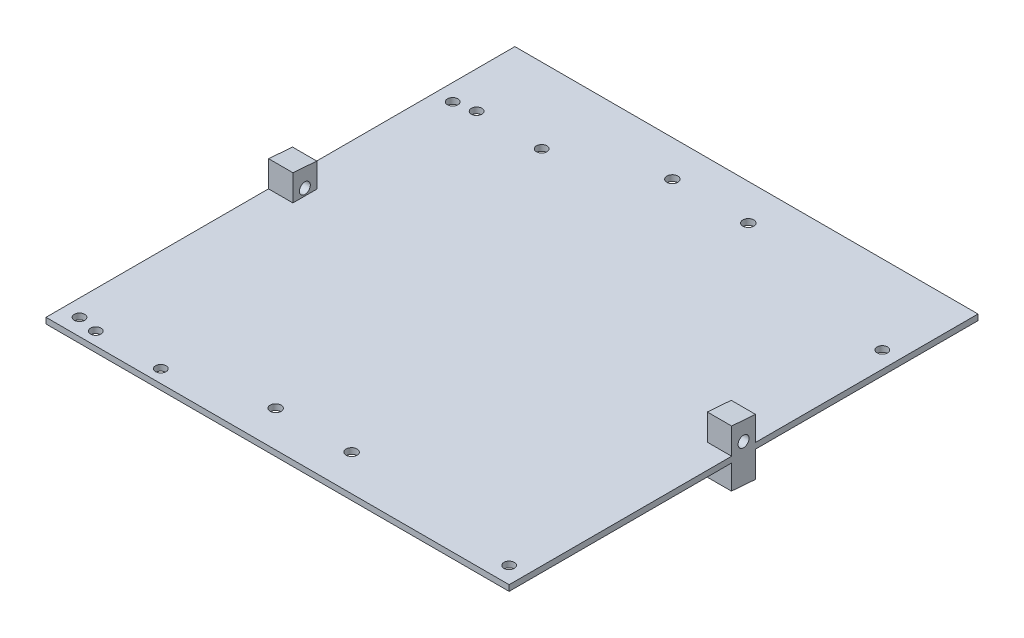
ISO-10303-21;
HEADER;
FILE_DESCRIPTION(('STEP AP214'),'2;1');
FILE_NAME('part.step','',(''),(''),'','','');
FILE_SCHEMA(('AUTOMOTIVE_DESIGN { 1 0 10303 214 1 1 1 1 }'));
ENDSEC;
DATA;
#1=APPLICATION_CONTEXT('core data for automotive mechanical design processes');
#2=APPLICATION_PROTOCOL_DEFINITION('international standard','automotive_design',2000,#1);
#3=PRODUCT_CONTEXT('',#1,'mechanical');
#4=PRODUCT('Part','Part','',(#3));
#5=PRODUCT_RELATED_PRODUCT_CATEGORY('part','',(#4));
#6=PRODUCT_DEFINITION_FORMATION('','',#4);
#7=PRODUCT_DEFINITION_CONTEXT('part definition',#1,'design');
#8=PRODUCT_DEFINITION('design','',#6,#7);
#9=PRODUCT_DEFINITION_SHAPE('','',#8);
#10=(LENGTH_UNIT() NAMED_UNIT(*) SI_UNIT(.MILLI.,.METRE.));
#11=(NAMED_UNIT(*) PLANE_ANGLE_UNIT() SI_UNIT($,.RADIAN.));
#12=(NAMED_UNIT(*) SI_UNIT($,.STERADIAN.) SOLID_ANGLE_UNIT());
#13=UNCERTAINTY_MEASURE_WITH_UNIT(LENGTH_MEASURE(1.E-05),#10,'distance_accuracy_value','');
#14=(GEOMETRIC_REPRESENTATION_CONTEXT(3) GLOBAL_UNCERTAINTY_ASSIGNED_CONTEXT((#13)) GLOBAL_UNIT_ASSIGNED_CONTEXT((#10,
#11,#12)) REPRESENTATION_CONTEXT('',''));
#15=CARTESIAN_POINT('',(0.,0.,0.));
#16=DIRECTION('',(0.,0.,1.));
#17=DIRECTION('',(1.,0.,0.));
#18=AXIS2_PLACEMENT_3D('',#15,#16,#17);
#19=CARTESIAN_POINT('',(0.,0.,0.));
#20=DIRECTION('',(0.,1.,0.));
#21=DIRECTION('',(0.,0.,1.));
#22=AXIS2_PLACEMENT_3D('',#19,#20,#21);
#23=PLANE('',#22);
#24=CARTESIAN_POINT('',(56.337499948,0.,90.459375));
#25=DIRECTION('',(0.,1.,0.));
#26=DIRECTION('',(0.,0.,1.));
#27=AXIS2_PLACEMENT_3D('',#24,#25,#26);
#28=CIRCLE('',#27,1.14299999999999);
#29=CARTESIAN_POINT('',(56.337499948,0.,91.602375));
#30=VERTEX_POINT('',#29);
#31=EDGE_CURVE('E330',#30,#30,#28,.F.);
#32=ORIENTED_EDGE('',*,*,#31,.F.);
#33=EDGE_LOOP('',(#32));
#34=FACE_BOUND('',#33,.T.);
#35=CARTESIAN_POINT('',(40.462499948,0.,90.459375));
#36=DIRECTION('',(0.,1.,0.));
#37=DIRECTION('',(0.,0.,1.));
#38=AXIS2_PLACEMENT_3D('',#35,#36,#37);
#39=CIRCLE('',#38,1.143);
#40=CARTESIAN_POINT('',(40.462499948,0.,91.602375));
#41=VERTEX_POINT('',#40);
#42=EDGE_CURVE('E323',#41,#41,#39,.F.);
#43=ORIENTED_EDGE('',*,*,#42,.F.);
#44=EDGE_LOOP('',(#43));
#45=FACE_BOUND('',#44,.T.);
#46=CARTESIAN_POINT('',(40.462499948,0.,7.540625));
#47=DIRECTION('',(0.,1.,0.));
#48=DIRECTION('',(0.,0.,1.));
#49=AXIS2_PLACEMENT_3D('',#46,#47,#48);
#50=CIRCLE('',#49,1.143);
#51=CARTESIAN_POINT('',(40.462499948,0.,8.683625));
#52=VERTEX_POINT('',#51);
#53=EDGE_CURVE('E322',#52,#52,#50,.F.);
#54=ORIENTED_EDGE('',*,*,#53,.F.);
#55=EDGE_LOOP('',(#54));
#56=FACE_BOUND('',#55,.T.);
#57=CARTESIAN_POINT('',(56.337499948,0.,7.540625));
#58=DIRECTION('',(0.,1.,0.));
#59=DIRECTION('',(0.,0.,1.));
#60=AXIS2_PLACEMENT_3D('',#57,#58,#59);
#61=CIRCLE('',#60,1.143);
#62=CARTESIAN_POINT('',(56.337499948,0.,8.68362499999999));
#63=VERTEX_POINT('',#62);
#64=EDGE_CURVE('E339',#63,#63,#61,.F.);
#65=ORIENTED_EDGE('',*,*,#64,.F.);
#66=EDGE_LOOP('',(#65));
#67=FACE_BOUND('',#66,.T.);
#68=CARTESIAN_POINT('',(7.70000000000002,0.,95.3));
#69=DIRECTION('',(0.,-1.,0.));
#70=DIRECTION('',(0.,0.,-1.));
#71=AXIS2_PLACEMENT_3D('',#68,#69,#70);
#72=CIRCLE('',#71,1.09220000000001);
#73=CARTESIAN_POINT('',(7.70000000000002,0.,94.2078));
#74=VERTEX_POINT('',#73);
#75=EDGE_CURVE('E361',#74,#74,#72,.T.);
#76=ORIENTED_EDGE('',*,*,#75,.F.);
#77=EDGE_LOOP('',(#76));
#78=FACE_BOUND('',#77,.T.);
#79=CARTESIAN_POINT('',(21.3,0.,95.3));
#80=DIRECTION('',(0.,-1.,0.));
#81=DIRECTION('',(0.,0.,-1.));
#82=AXIS2_PLACEMENT_3D('',#79,#80,#81);
#83=CIRCLE('',#82,1.09220000000001);
#84=CARTESIAN_POINT('',(21.3,0.,94.2078));
#85=VERTEX_POINT('',#84);
#86=EDGE_CURVE('E368',#85,#85,#83,.T.);
#87=ORIENTED_EDGE('',*,*,#86,.F.);
#88=EDGE_LOOP('',(#87));
#89=FACE_BOUND('',#88,.T.);
#90=CARTESIAN_POINT('',(93.3,0.,94.4999999999999));
#91=DIRECTION('',(0.,-1.,0.));
#92=DIRECTION('',(0.,0.,-1.));
#93=AXIS2_PLACEMENT_3D('',#90,#91,#92);
#94=CIRCLE('',#93,1.0922);
#95=CARTESIAN_POINT('',(93.3,0.,93.4077999999999));
#96=VERTEX_POINT('',#95);
#97=EDGE_CURVE('E374',#96,#96,#94,.T.);
#98=ORIENTED_EDGE('',*,*,#97,.F.);
#99=EDGE_LOOP('',(#98));
#100=FACE_BOUND('',#99,.T.);
#101=CARTESIAN_POINT('',(93.3,0.,16.5));
#102=DIRECTION('',(0.,-1.,0.));
#103=DIRECTION('',(0.,0.,-1.));
#104=AXIS2_PLACEMENT_3D('',#101,#102,#103);
#105=CIRCLE('',#104,1.0922);
#106=CARTESIAN_POINT('',(93.3,0.,15.4078));
#107=VERTEX_POINT('',#106);
#108=EDGE_CURVE('E380',#107,#107,#105,.T.);
#109=ORIENTED_EDGE('',*,*,#108,.F.);
#110=EDGE_LOOP('',(#109));
#111=FACE_BOUND('',#110,.T.);
#112=CARTESIAN_POINT('',(3.5,0.,16.5));
#113=DIRECTION('',(0.,-1.,0.));
#114=DIRECTION('',(0.,0.,-1.));
#115=AXIS2_PLACEMENT_3D('',#112,#113,#114);
#116=CIRCLE('',#115,1.0922);
#117=CARTESIAN_POINT('',(3.5,0.,15.4078));
#118=VERTEX_POINT('',#117);
#119=EDGE_CURVE('E343',#118,#118,#116,.T.);
#120=ORIENTED_EDGE('',*,*,#119,.F.);
#121=EDGE_LOOP('',(#120));
#122=FACE_BOUND('',#121,.T.);
#123=CARTESIAN_POINT('',(7.7,0.,15.7));
#124=DIRECTION('',(0.,-1.,0.));
#125=DIRECTION('',(0.,0.,-1.));
#126=AXIS2_PLACEMENT_3D('',#123,#124,#125);
#127=CIRCLE('',#126,1.09220000000001);
#128=CARTESIAN_POINT('',(7.7,0.,14.6078));
#129=VERTEX_POINT('',#128);
#130=EDGE_CURVE('E350',#129,#129,#127,.T.);
#131=ORIENTED_EDGE('',*,*,#130,.F.);
#132=EDGE_LOOP('',(#131));
#133=FACE_BOUND('',#132,.T.);
#134=CARTESIAN_POINT('',(21.3,0.,15.7));
#135=DIRECTION('',(0.,-1.,0.));
#136=DIRECTION('',(0.,0.,-1.));
#137=AXIS2_PLACEMENT_3D('',#134,#135,#136);
#138=CIRCLE('',#137,1.09220000000001);
#139=CARTESIAN_POINT('',(21.3,0.,14.6078));
#140=VERTEX_POINT('',#139);
#141=EDGE_CURVE('E356',#140,#140,#138,.T.);
#142=ORIENTED_EDGE('',*,*,#141,.F.);
#143=EDGE_LOOP('',(#142));
#144=FACE_BOUND('',#143,.T.);
#145=CARTESIAN_POINT('',(3.50000000000002,0.,94.5));
#146=DIRECTION('',(0.,-1.,0.));
#147=DIRECTION('',(0.,0.,-1.));
#148=AXIS2_PLACEMENT_3D('',#145,#146,#147);
#149=CIRCLE('',#148,1.09220000000001);
#150=CARTESIAN_POINT('',(3.50000000000002,0.,93.4078));
#151=VERTEX_POINT('',#150);
#152=EDGE_CURVE('E385',#151,#151,#149,.T.);
#153=ORIENTED_EDGE('',*,*,#152,.F.);
#154=EDGE_LOOP('',(#153));
#155=FACE_BOUND('',#154,.T.);
#156=DIRECTION('',(-1.,0.,0.));
#157=VECTOR('',#156,1.);
#158=CARTESIAN_POINT('',(96.799999948,0.,51.54));
#159=LINE('',#158,#157);
#160=CARTESIAN_POINT('',(96.799999948,0.,51.54));
#161=VERTEX_POINT('',#160);
#162=CARTESIAN_POINT('',(91.719999948,0.,51.54));
#163=VERTEX_POINT('',#162);
#164=EDGE_CURVE('E240',#161,#163,#159,.T.);
#165=ORIENTED_EDGE('',*,*,#164,.F.);
#166=DIRECTION('',(0.,0.,-1.));
#167=VECTOR('',#166,1.);
#168=CARTESIAN_POINT('',(96.799999948,0.,0.));
#169=LINE('',#168,#167);
#170=CARTESIAN_POINT('',(96.799999948,0.,98.));
#171=VERTEX_POINT('',#170);
#172=EDGE_CURVE('E410',#171,#161,#169,.T.);
#173=ORIENTED_EDGE('',*,*,#172,.F.);
#174=DIRECTION('',(1.,0.,0.));
#175=VECTOR('',#174,1.);
#176=CARTESIAN_POINT('',(0.,0.,98.));
#177=LINE('',#176,#175);
#178=CARTESIAN_POINT('',(0.,0.,98.));
#179=VERTEX_POINT('',#178);
#180=EDGE_CURVE('E407',#179,#171,#177,.T.);
#181=ORIENTED_EDGE('',*,*,#180,.F.);
#182=DIRECTION('',(0.,0.,1.));
#183=VECTOR('',#182,1.);
#184=CARTESIAN_POINT('',(0.,0.,0.));
#185=LINE('',#184,#183);
#186=CARTESIAN_POINT('',(0.,0.,51.54));
#187=VERTEX_POINT('',#186);
#188=EDGE_CURVE('E388',#187,#179,#185,.T.);
#189=ORIENTED_EDGE('',*,*,#188,.F.);
#190=DIRECTION('',(-1.,0.,0.));
#191=VECTOR('',#190,1.);
#192=CARTESIAN_POINT('',(0.,0.,51.54));
#193=LINE('',#192,#191);
#194=CARTESIAN_POINT('',(5.08,0.,51.54));
#195=VERTEX_POINT('',#194);
#196=EDGE_CURVE('E263',#195,#187,#193,.T.);
#197=ORIENTED_EDGE('',*,*,#196,.F.);
#198=DIRECTION('',(0.,0.,1.));
#199=VECTOR('',#198,1.);
#200=CARTESIAN_POINT('',(5.08,0.,51.54));
#201=LINE('',#200,#199);
#202=CARTESIAN_POINT('',(5.08,0.,46.46));
#203=VERTEX_POINT('',#202);
#204=EDGE_CURVE('E72',#203,#195,#201,.T.);
#205=ORIENTED_EDGE('',*,*,#204,.F.);
#206=DIRECTION('',(1.,0.,0.));
#207=VECTOR('',#206,1.);
#208=CARTESIAN_POINT('',(5.08,0.,46.46));
#209=LINE('',#208,#207);
#210=CARTESIAN_POINT('',(0.,0.,46.46));
#211=VERTEX_POINT('',#210);
#212=EDGE_CURVE('E258',#211,#203,#209,.T.);
#213=ORIENTED_EDGE('',*,*,#212,.F.);
#214=CARTESIAN_POINT('',(0.,0.,0.));
#215=VERTEX_POINT('',#214);
#216=EDGE_CURVE('E404',#215,#211,#185,.T.);
#217=ORIENTED_EDGE('',*,*,#216,.F.);
#218=DIRECTION('',(-1.,0.,0.));
#219=VECTOR('',#218,1.);
#220=CARTESIAN_POINT('',(0.,0.,0.));
#221=LINE('',#220,#219);
#222=CARTESIAN_POINT('',(96.799999948,0.,0.));
#223=VERTEX_POINT('',#222);
#224=EDGE_CURVE('E395',#223,#215,#221,.T.);
#225=ORIENTED_EDGE('',*,*,#224,.F.);
#226=CARTESIAN_POINT('',(96.799999948,0.,46.46));
#227=VERTEX_POINT('',#226);
#228=EDGE_CURVE('E409',#227,#223,#169,.T.);
#229=ORIENTED_EDGE('',*,*,#228,.F.);
#230=DIRECTION('',(1.,0.,0.));
#231=VECTOR('',#230,1.);
#232=CARTESIAN_POINT('',(91.719999948,0.,46.46));
#233=LINE('',#232,#231);
#234=CARTESIAN_POINT('',(91.719999948,0.,46.46));
#235=VERTEX_POINT('',#234);
#236=EDGE_CURVE('E244',#235,#227,#233,.T.);
#237=ORIENTED_EDGE('',*,*,#236,.F.);
#238=DIRECTION('',(0.,0.,-1.));
#239=VECTOR('',#238,1.);
#240=CARTESIAN_POINT('',(91.719999948,0.,51.54));
#241=LINE('',#240,#239);
#242=EDGE_CURVE('E246',#163,#235,#241,.T.);
#243=ORIENTED_EDGE('',*,*,#242,.F.);
#244=EDGE_LOOP('',(#165,#173,#181,#189,#197,#205,#213,#217,#225,#229,#237,#243));
#245=FACE_BOUND('',#244,.T.);
#246=ADVANCED_FACE('F47',(#34,#45,#56,#67,#78,#89,#100,#111,#122,#133,#144,#155,#245),#23,.F.);
#247=CARTESIAN_POINT('',(0.0259999480000245,1.2192,46.5));
#248=DIRECTION('',(0.,0.,-1.));
#249=DIRECTION('',(-1.,0.,0.));
#250=AXIS2_PLACEMENT_3D('',#247,#248,#249);
#251=PLANE('',#250);
#252=DIRECTION('',(0.,1.,0.));
#253=VECTOR('',#252,1.);
#254=CARTESIAN_POINT('',(91.719999948,1.2192,46.5));
#255=LINE('',#254,#253);
#256=CARTESIAN_POINT('',(91.719999948,1.2192,46.5));
#257=VERTEX_POINT('',#256);
#258=CARTESIAN_POINT('',(91.719999948,6.2992,46.5));
#259=VERTEX_POINT('',#258);
#260=EDGE_CURVE('E284',#257,#259,#255,.T.);
#261=ORIENTED_EDGE('',*,*,#260,.T.);
#262=DIRECTION('',(1.,0.,0.));
#263=VECTOR('',#262,1.);
#264=CARTESIAN_POINT('',(0.0259999480000245,6.2992,46.5));
#265=LINE('',#264,#263);
#266=CARTESIAN_POINT('',(96.799999948,6.2992,46.5));
#267=VERTEX_POINT('',#266);
#268=EDGE_CURVE('E305',#259,#267,#265,.T.);
#269=ORIENTED_EDGE('',*,*,#268,.T.);
#270=DIRECTION('',(0.,1.,0.));
#271=VECTOR('',#270,1.);
#272=CARTESIAN_POINT('',(96.799999948,1.2192,46.5));
#273=LINE('',#272,#271);
#274=CARTESIAN_POINT('',(96.799999948,1.2192,46.5));
#275=VERTEX_POINT('',#274);
#276=EDGE_CURVE('E293',#275,#267,#273,.T.);
#277=ORIENTED_EDGE('',*,*,#276,.F.);
#278=DIRECTION('',(1.,0.,0.));
#279=VECTOR('',#278,1.);
#280=CARTESIAN_POINT('',(0.0259999480000245,1.2192,46.5));
#281=LINE('',#280,#279);
#282=EDGE_CURVE('E314',#257,#275,#281,.T.);
#283=ORIENTED_EDGE('',*,*,#282,.F.);
#284=EDGE_LOOP('',(#261,#269,#277,#283));
#285=FACE_BOUND('',#284,.T.);
#286=ADVANCED_FACE('F444',(#285),#251,.T.);
#287=CARTESIAN_POINT('',(0.0259999480000245,1.2192,51.5));
#288=DIRECTION('',(0.,0.,1.));
#289=DIRECTION('',(1.,0.,0.));
#290=AXIS2_PLACEMENT_3D('',#287,#288,#289);
#291=PLANE('',#290);
#292=DIRECTION('',(0.,1.,0.));
#293=VECTOR('',#292,1.);
#294=CARTESIAN_POINT('',(91.719999948,1.2192,51.5));
#295=LINE('',#294,#293);
#296=CARTESIAN_POINT('',(91.719999948,1.2192,51.5));
#297=VERTEX_POINT('',#296);
#298=CARTESIAN_POINT('',(91.719999948,6.69270853412306,51.5));
#299=VERTEX_POINT('',#298);
#300=EDGE_CURVE('E196',#297,#299,#295,.T.);
#301=ORIENTED_EDGE('',*,*,#300,.F.);
#302=DIRECTION('',(1.,0.,0.));
#303=VECTOR('',#302,1.);
#304=CARTESIAN_POINT('',(0.0259999480000245,1.2192,51.5));
#305=LINE('',#304,#303);
#306=CARTESIAN_POINT('',(96.799999948,1.2192,51.5));
#307=VERTEX_POINT('',#306);
#308=EDGE_CURVE('E316',#297,#307,#305,.T.);
#309=ORIENTED_EDGE('',*,*,#308,.T.);
#310=DIRECTION('',(0.,-1.,0.));
#311=VECTOR('',#310,1.);
#312=CARTESIAN_POINT('',(96.799999948,1.2192,51.5));
#313=LINE('',#312,#311);
#314=CARTESIAN_POINT('',(96.799999948,6.69270853412306,51.5));
#315=VERTEX_POINT('',#314);
#316=EDGE_CURVE('E300',#315,#307,#313,.T.);
#317=ORIENTED_EDGE('',*,*,#316,.F.);
#318=DIRECTION('',(1.,0.,0.));
#319=VECTOR('',#318,1.);
#320=CARTESIAN_POINT('',(91.719999948,6.69270853412306,51.5));
#321=LINE('',#320,#319);
#322=EDGE_CURVE('E218',#299,#315,#321,.T.);
#323=ORIENTED_EDGE('',*,*,#322,.F.);
#324=EDGE_LOOP('',(#301,#309,#317,#323));
#325=FACE_BOUND('',#324,.T.);
#326=ADVANCED_FACE('F451',(#325),#291,.T.);
#327=CARTESIAN_POINT('',(0.0259999480000245,2.64795,49.));
#328=DIRECTION('',(1.,0.,0.));
#329=DIRECTION('',(0.,0.,-1.));
#330=AXIS2_PLACEMENT_3D('',#327,#328,#329);
#331=CYLINDRICAL_SURFACE('',#330,1.143);
#332=CARTESIAN_POINT('',(91.719999948,2.64795,49.));
#333=DIRECTION('',(1.,0.,0.));
#334=DIRECTION('',(0.,0.,-1.));
#335=AXIS2_PLACEMENT_3D('',#332,#333,#334);
#336=CIRCLE('',#335,1.143);
#337=CARTESIAN_POINT('',(91.719999948,2.64795,47.857));
#338=VERTEX_POINT('',#337);
#339=EDGE_CURVE('E51',#338,#338,#336,.F.);
#340=ORIENTED_EDGE('',*,*,#339,.T.);
#341=EDGE_LOOP('',(#340));
#342=FACE_BOUND('',#341,.T.);
#343=CARTESIAN_POINT('',(96.799999948,2.64795,49.));
#344=DIRECTION('',(1.,0.,0.));
#345=DIRECTION('',(0.,0.,-1.));
#346=AXIS2_PLACEMENT_3D('',#343,#344,#345);
#347=CIRCLE('',#346,1.143);
#348=CARTESIAN_POINT('',(96.799999948,2.64795,47.857));
#349=VERTEX_POINT('',#348);
#350=EDGE_CURVE('E294',#349,#349,#347,.T.);
#351=ORIENTED_EDGE('',*,*,#350,.T.);
#352=EDGE_LOOP('',(#351));
#353=FACE_BOUND('',#352,.T.);
#354=ADVANCED_FACE('F426',(#342,#353),#331,.F.);
#355=CARTESIAN_POINT('',(0.,1.2192,0.));
#356=DIRECTION('',(1.,0.,0.));
#357=DIRECTION('',(0.,0.,-1.));
#358=AXIS2_PLACEMENT_3D('',#355,#356,#357);
#359=PLANE('',#358);
#360=ORIENTED_EDGE('',*,*,#216,.T.);
#361=DIRECTION('',(0.,1.,0.));
#362=VECTOR('',#361,1.);
#363=CARTESIAN_POINT('',(0.,-5.08,46.46));
#364=LINE('',#363,#362);
#365=CARTESIAN_POINT('',(0.,-5.47980467066903,46.46));
#366=VERTEX_POINT('',#365);
#367=EDGE_CURVE('E276',#366,#211,#364,.T.);
#368=ORIENTED_EDGE('',*,*,#367,.F.);
#369=DIRECTION('',(0.,0.0784590957278381,0.996917333733129));
#370=VECTOR('',#369,1.);
#371=CARTESIAN_POINT('',(0.,-5.47980467066903,46.46));
#372=LINE('',#371,#370);
#373=CARTESIAN_POINT('',(0.,-5.08,51.54));
#374=VERTEX_POINT('',#373);
#375=EDGE_CURVE('E231',#366,#374,#372,.T.);
#376=ORIENTED_EDGE('',*,*,#375,.T.);
#377=DIRECTION('',(0.,1.,0.));
#378=VECTOR('',#377,1.);
#379=CARTESIAN_POINT('',(0.,-5.08,51.54));
#380=LINE('',#379,#378);
#381=EDGE_CURVE('E262',#374,#187,#380,.T.);
#382=ORIENTED_EDGE('',*,*,#381,.T.);
#383=ORIENTED_EDGE('',*,*,#188,.T.);
#384=DIRECTION('',(0.,-1.,0.));
#385=VECTOR('',#384,1.);
#386=CARTESIAN_POINT('',(0.,1.2192,98.));
#387=LINE('',#386,#385);
#388=CARTESIAN_POINT('',(0.,1.2192,98.));
#389=VERTEX_POINT('',#388);
#390=EDGE_CURVE('E13',#389,#179,#387,.T.);
#391=ORIENTED_EDGE('',*,*,#390,.F.);
#392=DIRECTION('',(0.,0.,1.));
#393=VECTOR('',#392,1.);
#394=CARTESIAN_POINT('',(0.,1.2192,0.));
#395=LINE('',#394,#393);
#396=CARTESIAN_POINT('',(0.,1.2192,0.));
#397=VERTEX_POINT('',#396);
#398=EDGE_CURVE('E391',#397,#389,#395,.T.);
#399=ORIENTED_EDGE('',*,*,#398,.F.);
#400=DIRECTION('',(0.,-1.,0.));
#401=VECTOR('',#400,1.);
#402=CARTESIAN_POINT('',(0.,1.2192,0.));
#403=LINE('',#402,#401);
#404=EDGE_CURVE('E403',#397,#215,#403,.T.);
#405=ORIENTED_EDGE('',*,*,#404,.T.);
#406=EDGE_LOOP('',(#360,#368,#376,#382,#383,#391,#399,#405));
#407=FACE_BOUND('',#406,.T.);
#408=ADVANCED_FACE('F49',(#407),#359,.F.);
#409=CARTESIAN_POINT('',(0.,1.2192,98.));
#410=DIRECTION('',(0.,0.,-1.));
#411=DIRECTION('',(-1.,0.,0.));
#412=AXIS2_PLACEMENT_3D('',#409,#410,#411);
#413=PLANE('',#412);
#414=ORIENTED_EDGE('',*,*,#180,.T.);
#415=DIRECTION('',(0.,-1.,0.));
#416=VECTOR('',#415,1.);
#417=CARTESIAN_POINT('',(96.799999948,1.2192,98.));
#418=LINE('',#417,#416);
#419=CARTESIAN_POINT('',(96.799999948,1.2192,98.));
#420=VERTEX_POINT('',#419);
#421=EDGE_CURVE('E56',#420,#171,#418,.T.);
#422=ORIENTED_EDGE('',*,*,#421,.F.);
#423=DIRECTION('',(1.,0.,0.));
#424=VECTOR('',#423,1.);
#425=CARTESIAN_POINT('',(0.,1.2192,98.));
#426=LINE('',#425,#424);
#427=EDGE_CURVE('E394',#389,#420,#426,.T.);
#428=ORIENTED_EDGE('',*,*,#427,.F.);
#429=ORIENTED_EDGE('',*,*,#390,.T.);
#430=EDGE_LOOP('',(#414,#422,#428,#429));
#431=FACE_BOUND('',#430,.T.);
#432=ADVANCED_FACE('F467',(#431),#413,.F.);
#433=CARTESIAN_POINT('',(96.799999948,1.2192,0.));
#434=DIRECTION('',(-1.,0.,0.));
#435=DIRECTION('',(0.,0.,1.));
#436=AXIS2_PLACEMENT_3D('',#433,#434,#435);
#437=PLANE('',#436);
#438=ORIENTED_EDGE('',*,*,#172,.T.);
#439=DIRECTION('',(0.,1.,0.));
#440=VECTOR('',#439,1.);
#441=CARTESIAN_POINT('',(96.799999948,-5.08,51.54));
#442=LINE('',#441,#440);
#443=CARTESIAN_POINT('',(96.799999948,-5.08,51.54));
#444=VERTEX_POINT('',#443);
#445=EDGE_CURVE('E256',#444,#161,#442,.T.);
#446=ORIENTED_EDGE('',*,*,#445,.F.);
#447=DIRECTION('',(0.,-0.0784590957278448,-0.996917333733128));
#448=VECTOR('',#447,1.);
#449=CARTESIAN_POINT('',(96.799999948,-5.47980467066906,46.46));
#450=LINE('',#449,#448);
#451=CARTESIAN_POINT('',(96.799999948,-5.47980467066906,46.46));
#452=VERTEX_POINT('',#451);
#453=EDGE_CURVE('E223',#444,#452,#450,.T.);
#454=ORIENTED_EDGE('',*,*,#453,.T.);
#455=DIRECTION('',(0.,1.,0.));
#456=VECTOR('',#455,1.);
#457=CARTESIAN_POINT('',(96.799999948,-5.08,46.46));
#458=LINE('',#457,#456);
#459=EDGE_CURVE('E64',#452,#227,#458,.T.);
#460=ORIENTED_EDGE('',*,*,#459,.T.);
#461=ORIENTED_EDGE('',*,*,#228,.T.);
#462=DIRECTION('',(0.,-1.,0.));
#463=VECTOR('',#462,1.);
#464=CARTESIAN_POINT('',(96.799999948,1.2192,0.));
#465=LINE('',#464,#463);
#466=CARTESIAN_POINT('',(96.799999948,1.2192,0.));
#467=VERTEX_POINT('',#466);
#468=EDGE_CURVE('E416',#467,#223,#465,.T.);
#469=ORIENTED_EDGE('',*,*,#468,.F.);
#470=DIRECTION('',(0.,0.,-1.));
#471=VECTOR('',#470,1.);
#472=CARTESIAN_POINT('',(96.799999948,1.2192,0.));
#473=LINE('',#472,#471);
#474=EDGE_CURVE('E397',#275,#467,#473,.T.);
#475=ORIENTED_EDGE('',*,*,#474,.F.);
#476=ORIENTED_EDGE('',*,*,#276,.T.);
#477=DIRECTION('',(0.,0.0784590957278373,0.996917333733128));
#478=VECTOR('',#477,1.);
#479=CARTESIAN_POINT('',(96.799999948,6.69270853412306,51.5));
#480=LINE('',#479,#478);
#481=EDGE_CURVE('E206',#267,#315,#480,.T.);
#482=ORIENTED_EDGE('',*,*,#481,.T.);
#483=ORIENTED_EDGE('',*,*,#316,.T.);
#484=EDGE_CURVE('E398',#420,#307,#473,.T.);
#485=ORIENTED_EDGE('',*,*,#484,.F.);
#486=ORIENTED_EDGE('',*,*,#421,.T.);
#487=EDGE_LOOP('',(#438,#446,#454,#460,#461,#469,#475,#476,#482,#483,#485,#486));
#488=FACE_BOUND('',#487,.T.);
#489=ORIENTED_EDGE('',*,*,#350,.F.);
#490=EDGE_LOOP('',(#489));
#491=FACE_BOUND('',#490,.T.);
#492=ADVANCED_FACE('F464',(#488,#491),#437,.F.);
#493=CARTESIAN_POINT('',(0.,1.2192,0.));
#494=DIRECTION('',(0.,0.,1.));
#495=DIRECTION('',(1.,0.,0.));
#496=AXIS2_PLACEMENT_3D('',#493,#494,#495);
#497=PLANE('',#496);
#498=ORIENTED_EDGE('',*,*,#224,.T.);
#499=ORIENTED_EDGE('',*,*,#404,.F.);
#500=DIRECTION('',(-1.,0.,0.));
#501=VECTOR('',#500,1.);
#502=CARTESIAN_POINT('',(0.,1.2192,0.));
#503=LINE('',#502,#501);
#504=EDGE_CURVE('E401',#467,#397,#503,.T.);
#505=ORIENTED_EDGE('',*,*,#504,.F.);
#506=ORIENTED_EDGE('',*,*,#468,.T.);
#507=EDGE_LOOP('',(#498,#499,#505,#506));
#508=FACE_BOUND('',#507,.T.);
#509=ADVANCED_FACE('F461',(#508),#497,.F.);
#510=CARTESIAN_POINT('',(0.,1.2192,0.));
#511=DIRECTION('',(0.,1.,0.));
#512=DIRECTION('',(0.,0.,1.));
#513=AXIS2_PLACEMENT_3D('',#510,#511,#512);
#514=PLANE('',#513);
#515=CARTESIAN_POINT('',(0.0259999480000245,1.2192,46.5));
#516=VERTEX_POINT('',#515);
#517=CARTESIAN_POINT('',(5.10599994800002,1.2192,46.5));
#518=VERTEX_POINT('',#517);
#519=EDGE_CURVE('E310',#516,#518,#281,.T.);
#520=ORIENTED_EDGE('',*,*,#519,.T.);
#521=DIRECTION('',(0.,0.,1.));
#522=VECTOR('',#521,1.);
#523=CARTESIAN_POINT('',(5.10599994800002,1.2192,51.5));
#524=LINE('',#523,#522);
#525=CARTESIAN_POINT('',(5.10599994800002,1.2192,51.5));
#526=VERTEX_POINT('',#525);
#527=EDGE_CURVE('E282',#518,#526,#524,.T.);
#528=ORIENTED_EDGE('',*,*,#527,.T.);
#529=CARTESIAN_POINT('',(0.0259999480000245,1.2192,51.5));
#530=VERTEX_POINT('',#529);
#531=EDGE_CURVE('E192',#530,#526,#305,.T.);
#532=ORIENTED_EDGE('',*,*,#531,.F.);
#533=DIRECTION('',(0.,0.,-1.));
#534=VECTOR('',#533,1.);
#535=CARTESIAN_POINT('',(0.0259999480000245,1.2192,46.5));
#536=LINE('',#535,#534);
#537=EDGE_CURVE('E302',#530,#516,#536,.T.);
#538=ORIENTED_EDGE('',*,*,#537,.T.);
#539=EDGE_LOOP('',(#520,#528,#532,#538));
#540=FACE_BOUND('',#539,.T.);
#541=DIRECTION('',(0.,0.,-1.));
#542=VECTOR('',#541,1.);
#543=CARTESIAN_POINT('',(91.719999948,1.2192,51.5));
#544=LINE('',#543,#542);
#545=EDGE_CURVE('E279',#297,#257,#544,.T.);
#546=ORIENTED_EDGE('',*,*,#545,.T.);
#547=ORIENTED_EDGE('',*,*,#282,.T.);
#548=ORIENTED_EDGE('',*,*,#474,.T.);
#549=ORIENTED_EDGE('',*,*,#504,.T.);
#550=ORIENTED_EDGE('',*,*,#398,.T.);
#551=ORIENTED_EDGE('',*,*,#427,.T.);
#552=ORIENTED_EDGE('',*,*,#484,.T.);
#553=ORIENTED_EDGE('',*,*,#308,.F.);
#554=EDGE_LOOP('',(#546,#547,#548,#549,#550,#551,#552,#553));
#555=FACE_BOUND('',#554,.T.);
#556=CARTESIAN_POINT('',(56.337499948,1.2192,90.459375));
#557=DIRECTION('',(0.,1.,0.));
#558=DIRECTION('',(0.,0.,-1.));
#559=AXIS2_PLACEMENT_3D('',#556,#557,#558);
#560=CIRCLE('',#559,1.14299999999999);
#561=CARTESIAN_POINT('',(56.337499948,1.2192,89.316375));
#562=VERTEX_POINT('',#561);
#563=EDGE_CURVE('E313',#562,#562,#560,.T.);
#564=ORIENTED_EDGE('',*,*,#563,.F.);
#565=EDGE_LOOP('',(#564));
#566=FACE_BOUND('',#565,.T.);
#567=CARTESIAN_POINT('',(40.462499948,1.2192,90.459375));
#568=DIRECTION('',(0.,1.,0.));
#569=DIRECTION('',(0.,0.,-1.));
#570=AXIS2_PLACEMENT_3D('',#567,#568,#569);
#571=CIRCLE('',#570,1.143);
#572=CARTESIAN_POINT('',(40.462499948,1.2192,89.316375));
#573=VERTEX_POINT('',#572);
#574=EDGE_CURVE('E327',#573,#573,#571,.T.);
#575=ORIENTED_EDGE('',*,*,#574,.F.);
#576=EDGE_LOOP('',(#575));
#577=FACE_BOUND('',#576,.T.);
#578=CARTESIAN_POINT('',(40.462499948,1.2192,7.540625));
#579=DIRECTION('',(0.,1.,0.));
#580=DIRECTION('',(0.,0.,1.));
#581=AXIS2_PLACEMENT_3D('',#578,#579,#580);
#582=CIRCLE('',#581,1.143);
#583=CARTESIAN_POINT('',(40.462499948,1.2192,8.683625));
#584=VERTEX_POINT('',#583);
#585=EDGE_CURVE('E319',#584,#584,#582,.T.);
#586=ORIENTED_EDGE('',*,*,#585,.F.);
#587=EDGE_LOOP('',(#586));
#588=FACE_BOUND('',#587,.T.);
#589=CARTESIAN_POINT('',(56.337499948,1.2192,7.540625));
#590=DIRECTION('',(0.,1.,0.));
#591=DIRECTION('',(0.,0.,1.));
#592=AXIS2_PLACEMENT_3D('',#589,#590,#591);
#593=CIRCLE('',#592,1.143);
#594=CARTESIAN_POINT('',(56.337499948,1.2192,8.68362499999999));
#595=VERTEX_POINT('',#594);
#596=EDGE_CURVE('E326',#595,#595,#593,.T.);
#597=ORIENTED_EDGE('',*,*,#596,.F.);
#598=EDGE_LOOP('',(#597));
#599=FACE_BOUND('',#598,.T.);
#600=CARTESIAN_POINT('',(7.70000000000002,1.2192,95.3));
#601=DIRECTION('',(0.,1.,0.));
#602=DIRECTION('',(0.,0.,1.));
#603=AXIS2_PLACEMENT_3D('',#600,#601,#602);
#604=CIRCLE('',#603,1.09220000000001);
#605=CARTESIAN_POINT('',(7.70000000000002,1.2192,96.3922));
#606=VERTEX_POINT('',#605);
#607=EDGE_CURVE('E365',#606,#606,#604,.F.);
#608=ORIENTED_EDGE('',*,*,#607,.T.);
#609=EDGE_LOOP('',(#608));
#610=FACE_BOUND('',#609,.T.);
#611=CARTESIAN_POINT('',(21.3,1.2192,95.3));
#612=DIRECTION('',(0.,1.,0.));
#613=DIRECTION('',(0.,0.,1.));
#614=AXIS2_PLACEMENT_3D('',#611,#612,#613);
#615=CIRCLE('',#614,1.09220000000001);
#616=CARTESIAN_POINT('',(21.3,1.2192,96.3922));
#617=VERTEX_POINT('',#616);
#618=EDGE_CURVE('E371',#617,#617,#615,.F.);
#619=ORIENTED_EDGE('',*,*,#618,.T.);
#620=EDGE_LOOP('',(#619));
#621=FACE_BOUND('',#620,.T.);
#622=CARTESIAN_POINT('',(93.3,1.2192,94.4999999999999));
#623=DIRECTION('',(0.,1.,0.));
#624=DIRECTION('',(0.,0.,1.));
#625=AXIS2_PLACEMENT_3D('',#622,#623,#624);
#626=CIRCLE('',#625,1.0922);
#627=CARTESIAN_POINT('',(93.3,1.2192,95.5921999999999));
#628=VERTEX_POINT('',#627);
#629=EDGE_CURVE('E377',#628,#628,#626,.F.);
#630=ORIENTED_EDGE('',*,*,#629,.T.);
#631=EDGE_LOOP('',(#630));
#632=FACE_BOUND('',#631,.T.);
#633=CARTESIAN_POINT('',(93.3,1.2192,16.5));
#634=DIRECTION('',(0.,1.,0.));
#635=DIRECTION('',(0.,0.,1.));
#636=AXIS2_PLACEMENT_3D('',#633,#634,#635);
#637=CIRCLE('',#636,1.0922);
#638=CARTESIAN_POINT('',(93.3,1.2192,17.5921999999999));
#639=VERTEX_POINT('',#638);
#640=EDGE_CURVE('E346',#639,#639,#637,.F.);
#641=ORIENTED_EDGE('',*,*,#640,.T.);
#642=EDGE_LOOP('',(#641));
#643=FACE_BOUND('',#642,.T.);
#644=CARTESIAN_POINT('',(3.5,1.2192,16.5));
#645=DIRECTION('',(0.,1.,0.));
#646=DIRECTION('',(0.,0.,1.));
#647=AXIS2_PLACEMENT_3D('',#644,#645,#646);
#648=CIRCLE('',#647,1.0922);
#649=CARTESIAN_POINT('',(3.5,1.2192,17.5922));
#650=VERTEX_POINT('',#649);
#651=EDGE_CURVE('E347',#650,#650,#648,.F.);
#652=ORIENTED_EDGE('',*,*,#651,.T.);
#653=EDGE_LOOP('',(#652));
#654=FACE_BOUND('',#653,.T.);
#655=CARTESIAN_POINT('',(7.7,1.2192,15.7));
#656=DIRECTION('',(0.,1.,0.));
#657=DIRECTION('',(0.,0.,1.));
#658=AXIS2_PLACEMENT_3D('',#655,#656,#657);
#659=CIRCLE('',#658,1.09220000000001);
#660=CARTESIAN_POINT('',(7.7,1.2192,16.7922));
#661=VERTEX_POINT('',#660);
#662=EDGE_CURVE('E353',#661,#661,#659,.F.);
#663=ORIENTED_EDGE('',*,*,#662,.T.);
#664=EDGE_LOOP('',(#663));
#665=FACE_BOUND('',#664,.T.);
#666=CARTESIAN_POINT('',(21.3,1.2192,15.7));
#667=DIRECTION('',(0.,1.,0.));
#668=DIRECTION('',(0.,0.,1.));
#669=AXIS2_PLACEMENT_3D('',#666,#667,#668);
#670=CIRCLE('',#669,1.09220000000001);
#671=CARTESIAN_POINT('',(21.3,1.2192,16.7922));
#672=VERTEX_POINT('',#671);
#673=EDGE_CURVE('E342',#672,#672,#670,.F.);
#674=ORIENTED_EDGE('',*,*,#673,.T.);
#675=EDGE_LOOP('',(#674));
#676=FACE_BOUND('',#675,.T.);
#677=CARTESIAN_POINT('',(3.50000000000002,1.2192,94.5));
#678=DIRECTION('',(0.,1.,0.));
#679=DIRECTION('',(0.,0.,1.));
#680=AXIS2_PLACEMENT_3D('',#677,#678,#679);
#681=CIRCLE('',#680,1.09220000000001);
#682=CARTESIAN_POINT('',(3.50000000000002,1.2192,95.5922));
#683=VERTEX_POINT('',#682);
#684=EDGE_CURVE('E364',#683,#683,#681,.F.);
#685=ORIENTED_EDGE('',*,*,#684,.T.);
#686=EDGE_LOOP('',(#685));
#687=FACE_BOUND('',#686,.T.);
#688=ADVANCED_FACE('F459',(#540,#555,#566,#577,#588,#599,#610,#621,#632,#643,#654,#665,#676,
#687),#514,.T.);
#689=CARTESIAN_POINT('',(3.50000000000002,1.2202,94.5));
#690=DIRECTION('',(0.,-1.,0.));
#691=DIRECTION('',(0.,0.,-1.));
#692=AXIS2_PLACEMENT_3D('',#689,#690,#691);
#693=CYLINDRICAL_SURFACE('',#692,1.09220000000001);
#694=ORIENTED_EDGE('',*,*,#684,.F.);
#695=EDGE_LOOP('',(#694));
#696=FACE_BOUND('',#695,.T.);
#697=ORIENTED_EDGE('',*,*,#152,.T.);
#698=EDGE_LOOP('',(#697));
#699=FACE_BOUND('',#698,.T.);
#700=ADVANCED_FACE('F561',(#696,#699),#693,.F.);
#701=CARTESIAN_POINT('',(21.3,1.2202,15.7));
#702=DIRECTION('',(0.,-1.,0.));
#703=DIRECTION('',(0.,0.,-1.));
#704=AXIS2_PLACEMENT_3D('',#701,#702,#703);
#705=CYLINDRICAL_SURFACE('',#704,1.09220000000001);
#706=ORIENTED_EDGE('',*,*,#673,.F.);
#707=EDGE_LOOP('',(#706));
#708=FACE_BOUND('',#707,.T.);
#709=ORIENTED_EDGE('',*,*,#141,.T.);
#710=EDGE_LOOP('',(#709));
#711=FACE_BOUND('',#710,.T.);
#712=ADVANCED_FACE('F557',(#708,#711),#705,.F.);
#713=CARTESIAN_POINT('',(7.7,1.2202,15.7));
#714=DIRECTION('',(0.,-1.,0.));
#715=DIRECTION('',(0.,0.,-1.));
#716=AXIS2_PLACEMENT_3D('',#713,#714,#715);
#717=CYLINDRICAL_SURFACE('',#716,1.09220000000001);
#718=ORIENTED_EDGE('',*,*,#662,.F.);
#719=EDGE_LOOP('',(#718));
#720=FACE_BOUND('',#719,.T.);
#721=ORIENTED_EDGE('',*,*,#130,.T.);
#722=EDGE_LOOP('',(#721));
#723=FACE_BOUND('',#722,.T.);
#724=ADVANCED_FACE('F553',(#720,#723),#717,.F.);
#725=CARTESIAN_POINT('',(3.5,1.2202,16.5));
#726=DIRECTION('',(0.,-1.,0.));
#727=DIRECTION('',(0.,0.,-1.));
#728=AXIS2_PLACEMENT_3D('',#725,#726,#727);
#729=CYLINDRICAL_SURFACE('',#728,1.0922);
#730=ORIENTED_EDGE('',*,*,#651,.F.);
#731=EDGE_LOOP('',(#730));
#732=FACE_BOUND('',#731,.T.);
#733=ORIENTED_EDGE('',*,*,#119,.T.);
#734=EDGE_LOOP('',(#733));
#735=FACE_BOUND('',#734,.T.);
#736=ADVANCED_FACE('F549',(#732,#735),#729,.F.);
#737=CARTESIAN_POINT('',(93.3,1.2202,16.5));
#738=DIRECTION('',(0.,-1.,0.));
#739=DIRECTION('',(0.,0.,-1.));
#740=AXIS2_PLACEMENT_3D('',#737,#738,#739);
#741=CYLINDRICAL_SURFACE('',#740,1.0922);
#742=ORIENTED_EDGE('',*,*,#640,.F.);
#743=EDGE_LOOP('',(#742));
#744=FACE_BOUND('',#743,.T.);
#745=ORIENTED_EDGE('',*,*,#108,.T.);
#746=EDGE_LOOP('',(#745));
#747=FACE_BOUND('',#746,.T.);
#748=ADVANCED_FACE('F552',(#744,#747),#741,.F.);
#749=CARTESIAN_POINT('',(93.3,1.2202,94.4999999999999));
#750=DIRECTION('',(0.,-1.,0.));
#751=DIRECTION('',(0.,0.,-1.));
#752=AXIS2_PLACEMENT_3D('',#749,#750,#751);
#753=CYLINDRICAL_SURFACE('',#752,1.0922);
#754=ORIENTED_EDGE('',*,*,#629,.F.);
#755=EDGE_LOOP('',(#754));
#756=FACE_BOUND('',#755,.T.);
#757=ORIENTED_EDGE('',*,*,#97,.T.);
#758=EDGE_LOOP('',(#757));
#759=FACE_BOUND('',#758,.T.);
#760=ADVANCED_FACE('F569',(#756,#759),#753,.F.);
#761=CARTESIAN_POINT('',(21.3,1.2202,95.3));
#762=DIRECTION('',(0.,-1.,0.));
#763=DIRECTION('',(0.,0.,-1.));
#764=AXIS2_PLACEMENT_3D('',#761,#762,#763);
#765=CYLINDRICAL_SURFACE('',#764,1.09220000000001);
#766=ORIENTED_EDGE('',*,*,#618,.F.);
#767=EDGE_LOOP('',(#766));
#768=FACE_BOUND('',#767,.T.);
#769=ORIENTED_EDGE('',*,*,#86,.T.);
#770=EDGE_LOOP('',(#769));
#771=FACE_BOUND('',#770,.T.);
#772=ADVANCED_FACE('F565',(#768,#771),#765,.F.);
#773=CARTESIAN_POINT('',(7.70000000000002,1.2202,95.3));
#774=DIRECTION('',(0.,-1.,0.));
#775=DIRECTION('',(0.,0.,-1.));
#776=AXIS2_PLACEMENT_3D('',#773,#774,#775);
#777=CYLINDRICAL_SURFACE('',#776,1.09220000000001);
#778=ORIENTED_EDGE('',*,*,#607,.F.);
#779=EDGE_LOOP('',(#778));
#780=FACE_BOUND('',#779,.T.);
#781=ORIENTED_EDGE('',*,*,#75,.T.);
#782=EDGE_LOOP('',(#781));
#783=FACE_BOUND('',#782,.T.);
#784=ADVANCED_FACE('F547',(#780,#783),#777,.F.);
#785=CARTESIAN_POINT('',(56.337499948,-0.000999999999999916,7.540625));
#786=DIRECTION('',(0.,1.,0.));
#787=DIRECTION('',(0.,0.,1.));
#788=AXIS2_PLACEMENT_3D('',#785,#786,#787);
#789=CYLINDRICAL_SURFACE('',#788,1.143);
#790=ORIENTED_EDGE('',*,*,#596,.T.);
#791=EDGE_LOOP('',(#790));
#792=FACE_BOUND('',#791,.T.);
#793=ORIENTED_EDGE('',*,*,#64,.T.);
#794=EDGE_LOOP('',(#793));
#795=FACE_BOUND('',#794,.T.);
#796=ADVANCED_FACE('F540',(#792,#795),#789,.F.);
#797=CARTESIAN_POINT('',(40.462499948,-0.000999999999999916,7.540625));
#798=DIRECTION('',(0.,1.,0.));
#799=DIRECTION('',(0.,0.,1.));
#800=AXIS2_PLACEMENT_3D('',#797,#798,#799);
#801=CYLINDRICAL_SURFACE('',#800,1.143);
#802=ORIENTED_EDGE('',*,*,#585,.T.);
#803=EDGE_LOOP('',(#802));
#804=FACE_BOUND('',#803,.T.);
#805=ORIENTED_EDGE('',*,*,#53,.T.);
#806=EDGE_LOOP('',(#805));
#807=FACE_BOUND('',#806,.T.);
#808=ADVANCED_FACE('F537',(#804,#807),#801,.F.);
#809=CARTESIAN_POINT('',(40.462499948,-0.000999999999999916,90.459375));
#810=DIRECTION('',(0.,1.,0.));
#811=DIRECTION('',(0.,0.,1.));
#812=AXIS2_PLACEMENT_3D('',#809,#810,#811);
#813=CYLINDRICAL_SURFACE('',#812,1.143);
#814=ORIENTED_EDGE('',*,*,#574,.T.);
#815=EDGE_LOOP('',(#814));
#816=FACE_BOUND('',#815,.T.);
#817=ORIENTED_EDGE('',*,*,#42,.T.);
#818=EDGE_LOOP('',(#817));
#819=FACE_BOUND('',#818,.T.);
#820=ADVANCED_FACE('F533',(#816,#819),#813,.F.);
#821=CARTESIAN_POINT('',(56.337499948,-0.000999999999999916,90.459375));
#822=DIRECTION('',(0.,1.,0.));
#823=DIRECTION('',(0.,0.,1.));
#824=AXIS2_PLACEMENT_3D('',#821,#822,#823);
#825=CYLINDRICAL_SURFACE('',#824,1.14299999999999);
#826=ORIENTED_EDGE('',*,*,#563,.T.);
#827=EDGE_LOOP('',(#826));
#828=FACE_BOUND('',#827,.T.);
#829=ORIENTED_EDGE('',*,*,#31,.T.);
#830=EDGE_LOOP('',(#829));
#831=FACE_BOUND('',#830,.T.);
#832=ADVANCED_FACE('F527',(#828,#831),#825,.F.);
#833=DIRECTION('',(0.,1.,0.));
#834=VECTOR('',#833,1.);
#835=CARTESIAN_POINT('',(5.10599994800002,1.2192,46.5));
#836=LINE('',#835,#834);
#837=CARTESIAN_POINT('',(5.10599994800002,6.2992,46.5));
#838=VERTEX_POINT('',#837);
#839=EDGE_CURVE('E197',#518,#838,#836,.T.);
#840=ORIENTED_EDGE('',*,*,#839,.F.);
#841=ORIENTED_EDGE('',*,*,#519,.F.);
#842=DIRECTION('',(0.,1.,0.));
#843=VECTOR('',#842,1.);
#844=CARTESIAN_POINT('',(0.0259999480000245,1.2192,46.5));
#845=LINE('',#844,#843);
#846=CARTESIAN_POINT('',(0.0259999480000245,6.2992,46.5));
#847=VERTEX_POINT('',#846);
#848=EDGE_CURVE('E297',#516,#847,#845,.T.);
#849=ORIENTED_EDGE('',*,*,#848,.T.);
#850=EDGE_CURVE('E317',#847,#838,#265,.T.);
#851=ORIENTED_EDGE('',*,*,#850,.T.);
#852=EDGE_LOOP('',(#840,#841,#849,#851));
#853=FACE_BOUND('',#852,.T.);
#854=ADVANCED_FACE('F454',(#853),#251,.T.);
#855=DIRECTION('',(0.,1.,0.));
#856=VECTOR('',#855,1.);
#857=CARTESIAN_POINT('',(5.10599994800002,1.2192,51.5));
#858=LINE('',#857,#856);
#859=CARTESIAN_POINT('',(5.10599994800002,6.69270853412306,51.5));
#860=VERTEX_POINT('',#859);
#861=EDGE_CURVE('E186',#526,#860,#858,.T.);
#862=ORIENTED_EDGE('',*,*,#861,.T.);
#863=DIRECTION('',(-1.,0.,0.));
#864=VECTOR('',#863,1.);
#865=CARTESIAN_POINT('',(5.10599994800002,6.69270853412306,51.5));
#866=LINE('',#865,#864);
#867=CARTESIAN_POINT('',(0.0259999480000245,6.69270853412306,51.5));
#868=VERTEX_POINT('',#867);
#869=EDGE_CURVE('E189',#860,#868,#866,.T.);
#870=ORIENTED_EDGE('',*,*,#869,.T.);
#871=DIRECTION('',(0.,-1.,0.));
#872=VECTOR('',#871,1.);
#873=CARTESIAN_POINT('',(0.0259999480000245,1.2192,51.5));
#874=LINE('',#873,#872);
#875=EDGE_CURVE('E299',#868,#530,#874,.T.);
#876=ORIENTED_EDGE('',*,*,#875,.T.);
#877=ORIENTED_EDGE('',*,*,#531,.T.);
#878=EDGE_LOOP('',(#862,#870,#876,#877));
#879=FACE_BOUND('',#878,.T.);
#880=ADVANCED_FACE('F188',(#879),#291,.T.);
#881=CARTESIAN_POINT('',(0.0259999480000245,0.,0.));
#882=DIRECTION('',(1.,0.,0.));
#883=DIRECTION('',(0.,0.,-1.));
#884=AXIS2_PLACEMENT_3D('',#881,#882,#883);
#885=PLANE('',#884);
#886=CARTESIAN_POINT('',(0.0259999480000245,2.64795,49.));
#887=DIRECTION('',(1.,0.,0.));
#888=DIRECTION('',(0.,0.,-1.));
#889=AXIS2_PLACEMENT_3D('',#886,#887,#888);
#890=CIRCLE('',#889,1.143);
#891=CARTESIAN_POINT('',(0.0259999480000241,2.64795,47.857));
#892=VERTEX_POINT('',#891);
#893=EDGE_CURVE('E290',#892,#892,#890,.T.);
#894=ORIENTED_EDGE('',*,*,#893,.T.);
#895=EDGE_LOOP('',(#894));
#896=FACE_BOUND('',#895,.T.);
#897=ORIENTED_EDGE('',*,*,#848,.F.);
#898=ORIENTED_EDGE('',*,*,#537,.F.);
#899=ORIENTED_EDGE('',*,*,#875,.F.);
#900=DIRECTION('',(0.,-0.0784590957278379,-0.996917333733128));
#901=VECTOR('',#900,1.);
#902=CARTESIAN_POINT('',(0.0259999480000245,6.69270853412306,51.5));
#903=LINE('',#902,#901);
#904=EDGE_CURVE('E205',#868,#847,#903,.T.);
#905=ORIENTED_EDGE('',*,*,#904,.T.);
#906=EDGE_LOOP('',(#897,#898,#899,#905));
#907=FACE_BOUND('',#906,.T.);
#908=ADVANCED_FACE('F441',(#896,#907),#885,.F.);
#909=CARTESIAN_POINT('',(5.10599994800002,2.64795,49.));
#910=DIRECTION('',(-1.,0.,0.));
#911=DIRECTION('',(0.,0.,1.));
#912=AXIS2_PLACEMENT_3D('',#909,#910,#911);
#913=CIRCLE('',#912,1.143);
#914=CARTESIAN_POINT('',(5.10599994800002,2.64795,50.143));
#915=VERTEX_POINT('',#914);
#916=EDGE_CURVE('E285',#915,#915,#913,.F.);
#917=ORIENTED_EDGE('',*,*,#916,.T.);
#918=EDGE_LOOP('',(#917));
#919=FACE_BOUND('',#918,.T.);
#920=ORIENTED_EDGE('',*,*,#893,.F.);
#921=EDGE_LOOP('',(#920));
#922=FACE_BOUND('',#921,.T.);
#923=ADVANCED_FACE('F431',(#919,#922),#331,.F.);
#924=CARTESIAN_POINT('',(91.719999948,1.2192,51.5));
#925=DIRECTION('',(1.,0.,0.));
#926=DIRECTION('',(0.,0.,-1.));
#927=AXIS2_PLACEMENT_3D('',#924,#925,#926);
#928=PLANE('',#927);
#929=ORIENTED_EDGE('',*,*,#300,.T.);
#930=DIRECTION('',(0.,0.0784590957278373,0.996917333733128));
#931=VECTOR('',#930,1.);
#932=CARTESIAN_POINT('',(91.719999948,6.69270853412306,51.5));
#933=LINE('',#932,#931);
#934=EDGE_CURVE('E215',#259,#299,#933,.T.);
#935=ORIENTED_EDGE('',*,*,#934,.F.);
#936=ORIENTED_EDGE('',*,*,#260,.F.);
#937=ORIENTED_EDGE('',*,*,#545,.F.);
#938=EDGE_LOOP('',(#929,#935,#936,#937));
#939=FACE_BOUND('',#938,.T.);
#940=ORIENTED_EDGE('',*,*,#339,.F.);
#941=EDGE_LOOP('',(#940));
#942=FACE_BOUND('',#941,.T.);
#943=ADVANCED_FACE('F429',(#939,#942),#928,.F.);
#944=CARTESIAN_POINT('',(5.10599994800002,1.2192,51.5));
#945=DIRECTION('',(-1.,0.,0.));
#946=DIRECTION('',(0.,0.,1.));
#947=AXIS2_PLACEMENT_3D('',#944,#945,#946);
#948=PLANE('',#947);
#949=ORIENTED_EDGE('',*,*,#839,.T.);
#950=DIRECTION('',(0.,-0.0784590957278379,-0.996917333733128));
#951=VECTOR('',#950,1.);
#952=CARTESIAN_POINT('',(5.10599994800002,6.69270853412306,51.5));
#953=LINE('',#952,#951);
#954=EDGE_CURVE('E203',#860,#838,#953,.T.);
#955=ORIENTED_EDGE('',*,*,#954,.F.);
#956=ORIENTED_EDGE('',*,*,#861,.F.);
#957=ORIENTED_EDGE('',*,*,#527,.F.);
#958=EDGE_LOOP('',(#949,#955,#956,#957));
#959=FACE_BOUND('',#958,.T.);
#960=ORIENTED_EDGE('',*,*,#916,.F.);
#961=EDGE_LOOP('',(#960));
#962=FACE_BOUND('',#961,.T.);
#963=ADVANCED_FACE('F208',(#959,#962),#948,.F.);
#964=CARTESIAN_POINT('',(5.08,-5.08,46.46));
#965=DIRECTION('',(0.,0.,1.));
#966=DIRECTION('',(1.,0.,0.));
#967=AXIS2_PLACEMENT_3D('',#964,#965,#966);
#968=PLANE('',#967);
#969=ORIENTED_EDGE('',*,*,#212,.T.);
#970=DIRECTION('',(0.,1.,0.));
#971=VECTOR('',#970,1.);
#972=CARTESIAN_POINT('',(5.08,-5.08,46.46));
#973=LINE('',#972,#971);
#974=CARTESIAN_POINT('',(5.08000000000001,-5.47980467066903,46.46));
#975=VERTEX_POINT('',#974);
#976=EDGE_CURVE('E273',#975,#203,#973,.T.);
#977=ORIENTED_EDGE('',*,*,#976,.F.);
#978=DIRECTION('',(-1.,0.,0.));
#979=VECTOR('',#978,1.);
#980=CARTESIAN_POINT('',(5.08000000000001,-5.47980467066903,46.46));
#981=LINE('',#980,#979);
#982=EDGE_CURVE('E235',#975,#366,#981,.T.);
#983=ORIENTED_EDGE('',*,*,#982,.T.);
#984=ORIENTED_EDGE('',*,*,#367,.T.);
#985=EDGE_LOOP('',(#969,#977,#983,#984));
#986=FACE_BOUND('',#985,.T.);
#987=ADVANCED_FACE('F438',(#986),#968,.F.);
#988=CARTESIAN_POINT('',(5.08,-5.08,51.54));
#989=DIRECTION('',(-1.,0.,0.));
#990=DIRECTION('',(0.,0.,1.));
#991=AXIS2_PLACEMENT_3D('',#988,#989,#990);
#992=PLANE('',#991);
#993=ORIENTED_EDGE('',*,*,#204,.T.);
#994=DIRECTION('',(0.,1.,0.));
#995=VECTOR('',#994,1.);
#996=CARTESIAN_POINT('',(5.08,-5.08,51.54));
#997=LINE('',#996,#995);
#998=CARTESIAN_POINT('',(5.08,-5.08,51.54));
#999=VERTEX_POINT('',#998);
#1000=EDGE_CURVE('E270',#999,#195,#997,.T.);
#1001=ORIENTED_EDGE('',*,*,#1000,.F.);
#1002=DIRECTION('',(0.,0.0784590957278381,0.996917333733129));
#1003=VECTOR('',#1002,1.);
#1004=CARTESIAN_POINT('',(5.08000000000001,-5.47980467066903,46.46));
#1005=LINE('',#1004,#1003);
#1006=EDGE_CURVE('E232',#975,#999,#1005,.T.);
#1007=ORIENTED_EDGE('',*,*,#1006,.F.);
#1008=ORIENTED_EDGE('',*,*,#976,.T.);
#1009=EDGE_LOOP('',(#993,#1001,#1007,#1008));
#1010=FACE_BOUND('',#1009,.T.);
#1011=ADVANCED_FACE('F776',(#1010),#992,.F.);
#1012=CARTESIAN_POINT('',(0.,-5.08,51.54));
#1013=DIRECTION('',(0.,0.,-1.));
#1014=DIRECTION('',(-1.,0.,0.));
#1015=AXIS2_PLACEMENT_3D('',#1012,#1013,#1014);
#1016=PLANE('',#1015);
#1017=ORIENTED_EDGE('',*,*,#196,.T.);
#1018=ORIENTED_EDGE('',*,*,#381,.F.);
#1019=DIRECTION('',(-1.,0.,0.));
#1020=VECTOR('',#1019,1.);
#1021=CARTESIAN_POINT('',(0.,-5.08,51.54));
#1022=LINE('',#1021,#1020);
#1023=EDGE_CURVE('E259',#999,#374,#1022,.T.);
#1024=ORIENTED_EDGE('',*,*,#1023,.F.);
#1025=ORIENTED_EDGE('',*,*,#1000,.T.);
#1026=EDGE_LOOP('',(#1017,#1018,#1024,#1025));
#1027=FACE_BOUND('',#1026,.T.);
#1028=ADVANCED_FACE('F787',(#1027),#1016,.F.);
#1029=CARTESIAN_POINT('',(96.799999948,-5.08,51.54));
#1030=DIRECTION('',(0.,0.,-1.));
#1031=DIRECTION('',(-1.,0.,0.));
#1032=AXIS2_PLACEMENT_3D('',#1029,#1030,#1031);
#1033=PLANE('',#1032);
#1034=ORIENTED_EDGE('',*,*,#164,.T.);
#1035=DIRECTION('',(0.,1.,0.));
#1036=VECTOR('',#1035,1.);
#1037=CARTESIAN_POINT('',(91.719999948,-5.08,51.54));
#1038=LINE('',#1037,#1036);
#1039=CARTESIAN_POINT('',(91.719999948,-5.08,51.54));
#1040=VERTEX_POINT('',#1039);
#1041=EDGE_CURVE('E253',#1040,#163,#1038,.T.);
#1042=ORIENTED_EDGE('',*,*,#1041,.F.);
#1043=DIRECTION('',(-1.,0.,0.));
#1044=VECTOR('',#1043,1.);
#1045=CARTESIAN_POINT('',(96.799999948,-5.08,51.54));
#1046=LINE('',#1045,#1044);
#1047=EDGE_CURVE('E241',#444,#1040,#1046,.T.);
#1048=ORIENTED_EDGE('',*,*,#1047,.F.);
#1049=ORIENTED_EDGE('',*,*,#445,.T.);
#1050=EDGE_LOOP('',(#1034,#1042,#1048,#1049));
#1051=FACE_BOUND('',#1050,.T.);
#1052=ADVANCED_FACE('F485',(#1051),#1033,.F.);
#1053=CARTESIAN_POINT('',(91.719999948,-5.08,51.54));
#1054=DIRECTION('',(1.,0.,0.));
#1055=DIRECTION('',(0.,0.,-1.));
#1056=AXIS2_PLACEMENT_3D('',#1053,#1054,#1055);
#1057=PLANE('',#1056);
#1058=ORIENTED_EDGE('',*,*,#242,.T.);
#1059=DIRECTION('',(0.,1.,0.));
#1060=VECTOR('',#1059,1.);
#1061=CARTESIAN_POINT('',(91.719999948,-5.08,46.46));
#1062=LINE('',#1061,#1060);
#1063=CARTESIAN_POINT('',(91.719999948,-5.47980467066906,46.46));
#1064=VERTEX_POINT('',#1063);
#1065=EDGE_CURVE('E250',#1064,#235,#1062,.T.);
#1066=ORIENTED_EDGE('',*,*,#1065,.F.);
#1067=DIRECTION('',(0.,-0.0784590957278448,-0.996917333733128));
#1068=VECTOR('',#1067,1.);
#1069=CARTESIAN_POINT('',(91.719999948,-5.47980467066906,46.46));
#1070=LINE('',#1069,#1068);
#1071=EDGE_CURVE('E224',#1040,#1064,#1070,.T.);
#1072=ORIENTED_EDGE('',*,*,#1071,.F.);
#1073=ORIENTED_EDGE('',*,*,#1041,.T.);
#1074=EDGE_LOOP('',(#1058,#1066,#1072,#1073));
#1075=FACE_BOUND('',#1074,.T.);
#1076=ADVANCED_FACE('F489',(#1075),#1057,.F.);
#1077=CARTESIAN_POINT('',(91.719999948,-5.08,46.46));
#1078=DIRECTION('',(0.,0.,1.));
#1079=DIRECTION('',(1.,0.,0.));
#1080=AXIS2_PLACEMENT_3D('',#1077,#1078,#1079);
#1081=PLANE('',#1080);
#1082=ORIENTED_EDGE('',*,*,#236,.T.);
#1083=ORIENTED_EDGE('',*,*,#459,.F.);
#1084=DIRECTION('',(1.,0.,0.));
#1085=VECTOR('',#1084,1.);
#1086=CARTESIAN_POINT('',(91.719999948,-5.47980467066906,46.46));
#1087=LINE('',#1086,#1085);
#1088=EDGE_CURVE('E227',#1064,#452,#1087,.T.);
#1089=ORIENTED_EDGE('',*,*,#1088,.F.);
#1090=ORIENTED_EDGE('',*,*,#1065,.T.);
#1091=EDGE_LOOP('',(#1082,#1083,#1089,#1090));
#1092=FACE_BOUND('',#1091,.T.);
#1093=ADVANCED_FACE('F495',(#1092),#1081,.F.);
#1094=CARTESIAN_POINT('',(5.08000000000001,-5.47980467066903,46.46));
#1095=DIRECTION('',(0.,-0.996917333733129,0.0784590957278381));
#1096=DIRECTION('',(0.,-0.0784590957278381,-0.996917333733129));
#1097=AXIS2_PLACEMENT_3D('',#1094,#1095,#1096);
#1098=PLANE('',#1097);
#1099=ORIENTED_EDGE('',*,*,#375,.F.);
#1100=ORIENTED_EDGE('',*,*,#982,.F.);
#1101=ORIENTED_EDGE('',*,*,#1006,.T.);
#1102=ORIENTED_EDGE('',*,*,#1023,.T.);
#1103=EDGE_LOOP('',(#1099,#1100,#1101,#1102));
#1104=FACE_BOUND('',#1103,.T.);
#1105=ADVANCED_FACE('F802',(#1104),#1098,.T.);
#1106=CARTESIAN_POINT('',(91.719999948,-5.47980467066906,46.46));
#1107=DIRECTION('',(0.,-0.996917333733128,0.0784590957278448));
#1108=DIRECTION('',(0.,-0.0784590957278448,-0.996917333733128));
#1109=AXIS2_PLACEMENT_3D('',#1106,#1107,#1108);
#1110=PLANE('',#1109);
#1111=ORIENTED_EDGE('',*,*,#453,.F.);
#1112=ORIENTED_EDGE('',*,*,#1047,.T.);
#1113=ORIENTED_EDGE('',*,*,#1071,.T.);
#1114=ORIENTED_EDGE('',*,*,#1088,.T.);
#1115=EDGE_LOOP('',(#1111,#1112,#1113,#1114));
#1116=FACE_BOUND('',#1115,.T.);
#1117=ADVANCED_FACE('F493',(#1116),#1110,.T.);
#1118=CARTESIAN_POINT('',(91.719999948,6.69270853412306,51.5));
#1119=DIRECTION('',(0.,0.996917333733129,-0.0784590957278373));
#1120=DIRECTION('',(0.,0.0784590957278373,0.996917333733129));
#1121=AXIS2_PLACEMENT_3D('',#1118,#1119,#1120);
#1122=PLANE('',#1121);
#1123=ORIENTED_EDGE('',*,*,#481,.F.);
#1124=ORIENTED_EDGE('',*,*,#268,.F.);
#1125=ORIENTED_EDGE('',*,*,#934,.T.);
#1126=ORIENTED_EDGE('',*,*,#322,.T.);
#1127=EDGE_LOOP('',(#1123,#1124,#1125,#1126));
#1128=FACE_BOUND('',#1127,.T.);
#1129=ADVANCED_FACE('F511',(#1128),#1122,.T.);
#1130=CARTESIAN_POINT('',(5.10599994800002,6.69270853412306,51.5));
#1131=DIRECTION('',(0.,0.996917333733129,-0.078459095727838));
#1132=DIRECTION('',(0.,0.078459095727838,0.996917333733129));
#1133=AXIS2_PLACEMENT_3D('',#1130,#1131,#1132);
#1134=PLANE('',#1133);
#1135=ORIENTED_EDGE('',*,*,#904,.F.);
#1136=ORIENTED_EDGE('',*,*,#869,.F.);
#1137=ORIENTED_EDGE('',*,*,#954,.T.);
#1138=ORIENTED_EDGE('',*,*,#850,.F.);
#1139=EDGE_LOOP('',(#1135,#1136,#1137,#1138));
#1140=FACE_BOUND('',#1139,.T.);
#1141=ADVANCED_FACE('F201',(#1140),#1134,.T.);
#1142=CLOSED_SHELL('',(#246,#286,#326,#354,#408,#432,#492,#509,#688,#700,#712,#724,#736,#748,
#760,#772,#784,#796,#808,#820,#832,#854,#880,#908,#923,#943,#963,#987,#1011,#1028,#1052,#1076,
#1093,#1105,#1117,#1129,#1141));
#1143=MANIFOLD_SOLID_BREP('B2',#1142);
#1144=ADVANCED_BREP_SHAPE_REPRESENTATION('',(#18,#1143),#14);
#1145=SHAPE_DEFINITION_REPRESENTATION(#9,#1144);
ENDSEC;
END-ISO-10303-21;
